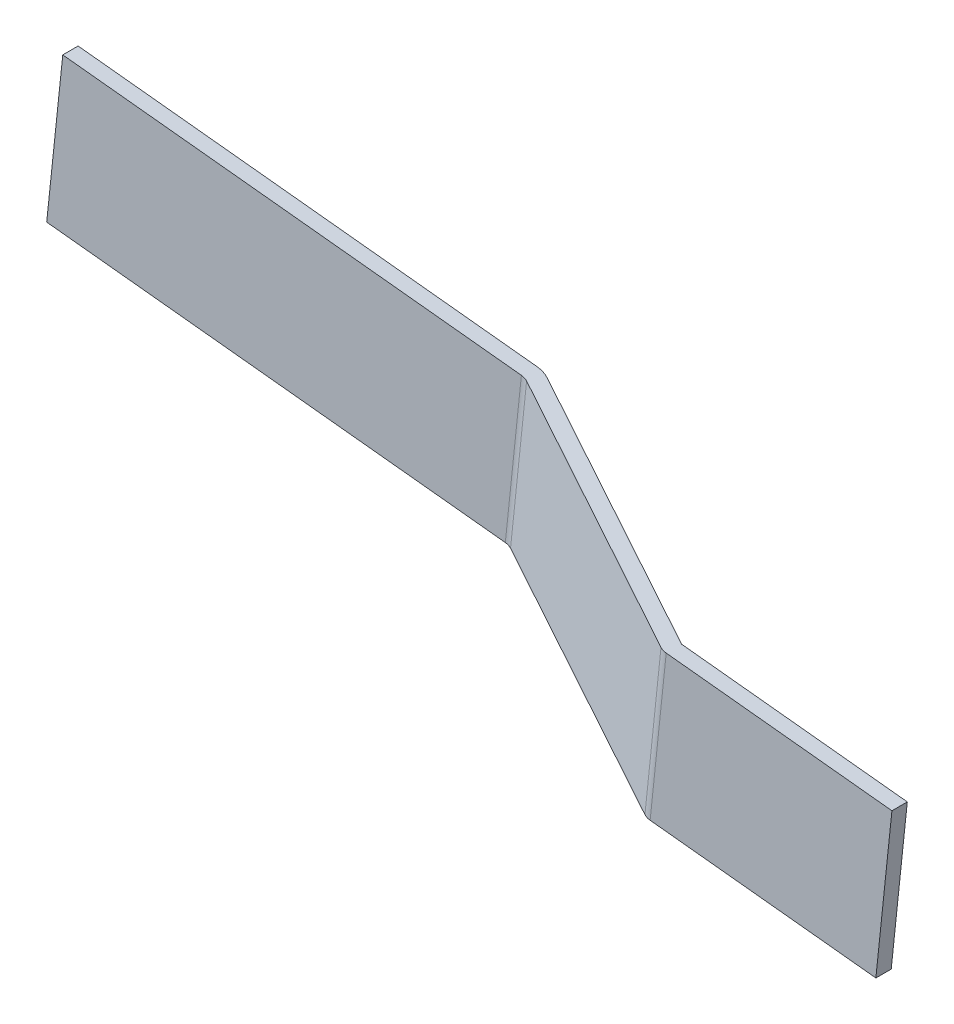
ISO-10303-21;
HEADER;
FILE_DESCRIPTION(('STEP AP214'),'2;1');
FILE_NAME('part.step','',(''),(''),'','','');
FILE_SCHEMA(('AUTOMOTIVE_DESIGN { 1 0 10303 214 1 1 1 1 }'));
ENDSEC;
DATA;
#1=APPLICATION_CONTEXT('core data for automotive mechanical design processes');
#2=APPLICATION_PROTOCOL_DEFINITION('international standard','automotive_design',2000,#1);
#3=PRODUCT_CONTEXT('',#1,'mechanical');
#4=PRODUCT('Part','Part','',(#3));
#5=PRODUCT_RELATED_PRODUCT_CATEGORY('part','',(#4));
#6=PRODUCT_DEFINITION_FORMATION('','',#4);
#7=PRODUCT_DEFINITION_CONTEXT('part definition',#1,'design');
#8=PRODUCT_DEFINITION('design','',#6,#7);
#9=PRODUCT_DEFINITION_SHAPE('','',#8);
#10=(LENGTH_UNIT() NAMED_UNIT(*) SI_UNIT(.MILLI.,.METRE.));
#11=(NAMED_UNIT(*) PLANE_ANGLE_UNIT() SI_UNIT($,.RADIAN.));
#12=(NAMED_UNIT(*) SI_UNIT($,.STERADIAN.) SOLID_ANGLE_UNIT());
#13=UNCERTAINTY_MEASURE_WITH_UNIT(LENGTH_MEASURE(1.E-05),#10,'distance_accuracy_value','');
#14=(GEOMETRIC_REPRESENTATION_CONTEXT(3) GLOBAL_UNCERTAINTY_ASSIGNED_CONTEXT((#13)) GLOBAL_UNIT_ASSIGNED_CONTEXT((#10,
#11,#12)) REPRESENTATION_CONTEXT('',''));
#15=CARTESIAN_POINT('',(0.,0.,0.));
#16=DIRECTION('',(0.,0.,1.));
#17=DIRECTION('',(1.,0.,0.));
#18=AXIS2_PLACEMENT_3D('',#15,#16,#17);
#19=CARTESIAN_POINT('',(33.7087147324462,3.75848377105127,-2.032));
#20=DIRECTION('',(0.104528463267647,0.994521895368274,0.));
#21=DIRECTION('',(-0.994521895368274,0.104528463267647,0.));
#22=AXIS2_PLACEMENT_3D('',#19,#20,#21);
#23=CYLINDRICAL_SURFACE('',#22,0.508000000000006);
#24=CARTESIAN_POINT('',(33.7087147324462,3.75848377105124,-2.032));
#25=DIRECTION('',(0.104528463267647,0.994521895368274,0.));
#26=DIRECTION('',(-0.994521895368274,0.104528463267647,0.));
#27=AXIS2_PLACEMENT_3D('',#24,#25,#26);
#28=CIRCLE('',#27,0.508000000000006);
#29=CARTESIAN_POINT('',(33.9341359375676,3.73479104767429,-2.48662944816696));
#30=VERTEX_POINT('',#29);
#31=CARTESIAN_POINT('',(33.7087147324462,3.75848377105125,-2.54));
#32=VERTEX_POINT('',#31);
#33=EDGE_CURVE('E115',#30,#32,#28,.T.);
#34=ORIENTED_EDGE('',*,*,#33,.T.);
#35=DIRECTION('',(-0.104528463267678,-0.994521895368271,0.));
#36=VECTOR('',#35,1.);
#37=CARTESIAN_POINT('',(33.9742170291461,6.28456938528667,-2.54));
#38=LINE('',#37,#36);
#39=CARTESIAN_POINT('',(33.9742170291461,6.28456938528668,-2.54));
#40=VERTEX_POINT('',#39);
#41=EDGE_CURVE('E113',#40,#32,#38,.T.);
#42=ORIENTED_EDGE('',*,*,#41,.F.);
#43=CARTESIAN_POINT('',(33.974217029146,6.28456938528668,-2.032));
#44=DIRECTION('',(0.104528463267647,0.994521895368274,0.));
#45=DIRECTION('',(-0.994521895368274,0.104528463267647,0.));
#46=AXIS2_PLACEMENT_3D('',#43,#44,#45);
#47=CIRCLE('',#46,0.508000000000006);
#48=CARTESIAN_POINT('',(34.1996382342674,6.26087666190973,-2.48662944816696));
#49=VERTEX_POINT('',#48);
#50=EDGE_CURVE('E20',#40,#49,#47,.F.);
#51=ORIENTED_EDGE('',*,*,#50,.T.);
#52=DIRECTION('',(0.104528463267656,0.994521895368273,0.));
#53=VECTOR('',#52,1.);
#54=CARTESIAN_POINT('',(33.9341359375676,3.73479104767429,-2.486629448167));
#55=LINE('',#54,#53);
#56=EDGE_CURVE('E110',#30,#49,#55,.T.);
#57=ORIENTED_EDGE('',*,*,#56,.F.);
#58=EDGE_LOOP('',(#34,#42,#51,#57));
#59=FACE_BOUND('',#58,.T.);
#60=ADVANCED_FACE('F17',(#59),#23,.T.);
#61=CARTESIAN_POINT('',(42.1173531444244,2.87470026113471,0.));
#62=DIRECTION('',(0.994521895368274,-0.104528463267646,0.));
#63=DIRECTION('',(0.104528463267646,0.994521895368274,0.));
#64=AXIS2_PLACEMENT_3D('',#61,#62,#63);
#65=PLANE('',#64);
#66=DIRECTION('',(0.,0.,1.));
#67=VECTOR('',#66,1.);
#68=CARTESIAN_POINT('',(42.1173531444244,2.87470026113471,0.));
#69=LINE('',#68,#67);
#70=CARTESIAN_POINT('',(42.1173531444244,2.87470026113473,0.));
#71=VERTEX_POINT('',#70);
#72=CARTESIAN_POINT('',(42.1173531444245,2.87470026113473,-0.254));
#73=VERTEX_POINT('',#72);
#74=EDGE_CURVE('E225',#71,#73,#69,.F.);
#75=ORIENTED_EDGE('',*,*,#74,.T.);
#76=DIRECTION('',(-0.104528463267677,-0.994521895368271,0.));
#77=VECTOR('',#76,1.);
#78=CARTESIAN_POINT('',(42.3828554411243,5.40078587537014,-0.254000000000001));
#79=LINE('',#78,#77);
#80=CARTESIAN_POINT('',(42.3828554411243,5.40078587537015,-0.254));
#81=VERTEX_POINT('',#80);
#82=EDGE_CURVE('E122',#81,#73,#79,.T.);
#83=ORIENTED_EDGE('',*,*,#82,.F.);
#84=DIRECTION('',(0.,0.,1.));
#85=VECTOR('',#84,1.);
#86=CARTESIAN_POINT('',(42.3828554411243,5.40078587537015,0.));
#87=LINE('',#86,#85);
#88=CARTESIAN_POINT('',(42.3828554411243,5.40078587537016,0.));
#89=VERTEX_POINT('',#88);
#90=EDGE_CURVE('E222',#81,#89,#87,.T.);
#91=ORIENTED_EDGE('',*,*,#90,.T.);
#92=DIRECTION('',(-0.104528463267677,-0.994521895368271,0.));
#93=VECTOR('',#92,1.);
#94=CARTESIAN_POINT('',(42.3828554411243,5.40078587537014,0.));
#95=LINE('',#94,#93);
#96=EDGE_CURVE('E200',#89,#71,#95,.T.);
#97=ORIENTED_EDGE('',*,*,#96,.T.);
#98=EDGE_LOOP('',(#75,#83,#91,#97));
#99=FACE_BOUND('',#98,.T.);
#100=ADVANCED_FACE('F280',(#99),#65,.T.);
#101=CARTESIAN_POINT('',(38.3877045013078,3.26670212957912,-0.254));
#102=DIRECTION('',(0.104528463267648,0.994521895368274,0.));
#103=DIRECTION('',(-0.994521895368274,0.104528463267648,0.));
#104=AXIS2_PLACEMENT_3D('',#101,#102,#103);
#105=CYLINDRICAL_SURFACE('',#104,0.253999999999999);
#106=CARTESIAN_POINT('',(38.3877045013078,3.26670212957912,-0.254));
#107=DIRECTION('',(0.104528463267648,0.994521895368274,0.));
#108=DIRECTION('',(-0.994521895368274,0.104528463267648,0.));
#109=AXIS2_PLACEMENT_3D('',#106,#107,#108);
#110=CIRCLE('',#109,0.253999999999999);
#111=CARTESIAN_POINT('',(38.2749938987471,3.27854849126762,-0.0266852759165332));
#112=VERTEX_POINT('',#111);
#113=CARTESIAN_POINT('',(38.3877045013078,3.26670212957915,0.));
#114=VERTEX_POINT('',#113);
#115=EDGE_CURVE('E213',#112,#114,#110,.T.);
#116=ORIENTED_EDGE('',*,*,#115,.T.);
#117=DIRECTION('',(0.104528463267676,0.994521895368271,0.));
#118=VECTOR('',#117,1.);
#119=CARTESIAN_POINT('',(38.3877045013078,3.26670212957913,0.));
#120=LINE('',#119,#118);
#121=CARTESIAN_POINT('',(38.6532067980076,5.79278774381459,0.));
#122=VERTEX_POINT('',#121);
#123=EDGE_CURVE('E196',#114,#122,#120,.T.);
#124=ORIENTED_EDGE('',*,*,#123,.T.);
#125=CARTESIAN_POINT('',(38.6532067980076,5.79278774381458,-0.254000000000001));
#126=DIRECTION('',(0.104528463267648,0.994521895368274,0.));
#127=DIRECTION('',(-0.994521895368274,0.104528463267648,0.));
#128=AXIS2_PLACEMENT_3D('',#125,#126,#127);
#129=CIRCLE('',#128,0.253999999999999);
#130=CARTESIAN_POINT('',(38.5404961954469,5.80463410550306,-0.0266852759165311));
#131=VERTEX_POINT('',#130);
#132=EDGE_CURVE('E230',#122,#131,#129,.F.);
#133=ORIENTED_EDGE('',*,*,#132,.T.);
#134=DIRECTION('',(-0.10452846326761,-0.994521895368278,0.));
#135=VECTOR('',#134,1.);
#136=CARTESIAN_POINT('',(38.5404961954469,5.80463410550307,-0.0266852759165698));
#137=LINE('',#136,#135);
#138=EDGE_CURVE('E192',#131,#112,#137,.T.);
#139=ORIENTED_EDGE('',*,*,#138,.T.);
#140=EDGE_LOOP('',(#116,#124,#133,#139));
#141=FACE_BOUND('',#140,.T.);
#142=ADVANCED_FACE('F277',(#141),#105,.T.);
#143=CARTESIAN_POINT('',(33.7087147324462,3.75848377105127,-2.54));
#144=DIRECTION('',(0.,0.,-1.));
#145=DIRECTION('',(0.,1.,0.));
#146=AXIS2_PLACEMENT_3D('',#143,#144,#145);
#147=PLANE('',#146);
#148=DIRECTION('',(0.994521895368274,-0.104528463267648,0.));
#149=VECTOR('',#148,1.);
#150=CARTESIAN_POINT('',(33.7087147324462,3.75848377105127,-2.54));
#151=LINE('',#150,#149);
#152=CARTESIAN_POINT('',(26.1304578897399,4.55499066115074,-2.54));
#153=VERTEX_POINT('',#152);
#154=EDGE_CURVE('E182',#153,#32,#151,.T.);
#155=ORIENTED_EDGE('',*,*,#154,.F.);
#156=DIRECTION('',(-0.104528463267646,-0.994521895368274,0.));
#157=VECTOR('',#156,1.);
#158=CARTESIAN_POINT('',(26.1304578897399,4.55499066115073,-2.54));
#159=LINE('',#158,#157);
#160=CARTESIAN_POINT('',(26.3959601864397,7.08107627538616,-2.54));
#161=VERTEX_POINT('',#160);
#162=EDGE_CURVE('E163',#161,#153,#159,.T.);
#163=ORIENTED_EDGE('',*,*,#162,.F.);
#164=DIRECTION('',(0.994521895368274,-0.104528463267648,0.));
#165=VECTOR('',#164,1.);
#166=CARTESIAN_POINT('',(33.9742170291461,6.28456938528668,-2.54));
#167=LINE('',#166,#165);
#168=EDGE_CURVE('E130',#161,#40,#167,.T.);
#169=ORIENTED_EDGE('',*,*,#168,.T.);
#170=ORIENTED_EDGE('',*,*,#41,.T.);
#171=EDGE_LOOP('',(#155,#163,#169,#170));
#172=FACE_BOUND('',#171,.T.);
#173=ADVANCED_FACE('F248',(#172),#147,.T.);
#174=CARTESIAN_POINT('',(38.3877045013078,3.26670212957912,-0.254));
#175=DIRECTION('',(0.443742529766581,-0.0466392192459703,-0.894939858596365));
#176=DIRECTION('',(-0.895914793501176,0.,-0.444225936642319));
#177=AXIS2_PLACEMENT_3D('',#174,#175,#176);
#178=PLANE('',#177);
#179=DIRECTION('',(0.890037284411877,-0.0935466881360443,0.446186787674747));
#180=VECTOR('',#179,1.);
#181=CARTESIAN_POINT('',(33.9341359375676,3.73479104767432,-2.48662944816695));
#182=LINE('',#181,#180);
#183=CARTESIAN_POINT('',(38.3877045013078,3.26670212957915,-0.254));
#184=VERTEX_POINT('',#183);
#185=EDGE_CURVE('E121',#30,#184,#182,.T.);
#186=ORIENTED_EDGE('',*,*,#185,.F.);
#187=ORIENTED_EDGE('',*,*,#56,.T.);
#188=DIRECTION('',(0.890037284411876,-0.0935466881360444,0.446186787674747));
#189=VECTOR('',#188,1.);
#190=CARTESIAN_POINT('',(34.1996382342674,6.26087666190974,-2.48662944816695));
#191=LINE('',#190,#189);
#192=CARTESIAN_POINT('',(38.6532067980077,5.79278774381459,-0.254));
#193=VERTEX_POINT('',#192);
#194=EDGE_CURVE('E120',#49,#193,#191,.T.);
#195=ORIENTED_EDGE('',*,*,#194,.T.);
#196=DIRECTION('',(0.104528463267657,0.994521895368273,0.));
#197=VECTOR('',#196,1.);
#198=CARTESIAN_POINT('',(38.3877045013078,3.26670212957912,-0.254000000000001));
#199=LINE('',#198,#197);
#200=EDGE_CURVE('E204',#184,#193,#199,.T.);
#201=ORIENTED_EDGE('',*,*,#200,.F.);
#202=EDGE_LOOP('',(#186,#187,#195,#201));
#203=FACE_BOUND('',#202,.T.);
#204=ADVANCED_FACE('F118',(#203),#178,.T.);
#205=CARTESIAN_POINT('',(42.1173531444244,2.87470026113471,-0.254));
#206=DIRECTION('',(0.,0.,-1.));
#207=DIRECTION('',(-1.,0.,0.));
#208=AXIS2_PLACEMENT_3D('',#205,#206,#207);
#209=PLANE('',#208);
#210=DIRECTION('',(0.994521895368274,-0.104528463267648,0.));
#211=VECTOR('',#210,1.);
#212=CARTESIAN_POINT('',(33.7087147324462,3.75848377105127,-0.253999999999999));
#213=LINE('',#212,#211);
#214=EDGE_CURVE('E177',#184,#73,#213,.T.);
#215=ORIENTED_EDGE('',*,*,#214,.F.);
#216=ORIENTED_EDGE('',*,*,#200,.T.);
#217=DIRECTION('',(0.994521895368274,-0.104528463267648,0.));
#218=VECTOR('',#217,1.);
#219=CARTESIAN_POINT('',(33.9742170291461,6.28456938528668,-0.253999999999999));
#220=LINE('',#219,#218);
#221=EDGE_CURVE('E128',#193,#81,#220,.T.);
#222=ORIENTED_EDGE('',*,*,#221,.T.);
#223=ORIENTED_EDGE('',*,*,#82,.T.);
#224=EDGE_LOOP('',(#215,#216,#222,#223));
#225=FACE_BOUND('',#224,.T.);
#226=ADVANCED_FACE('F282',(#225),#209,.T.);
#227=CARTESIAN_POINT('',(42.1173531444244,2.87470026113471,0.));
#228=DIRECTION('',(0.,0.,-1.));
#229=DIRECTION('',(-1.,0.,0.));
#230=AXIS2_PLACEMENT_3D('',#227,#228,#229);
#231=PLANE('',#230);
#232=ORIENTED_EDGE('',*,*,#123,.F.);
#233=DIRECTION('',(0.994521895368274,-0.104528463267648,0.));
#234=VECTOR('',#233,1.);
#235=CARTESIAN_POINT('',(33.7087147324462,3.75848377105127,0.));
#236=LINE('',#235,#234);
#237=EDGE_CURVE('E173',#71,#114,#236,.F.);
#238=ORIENTED_EDGE('',*,*,#237,.F.);
#239=ORIENTED_EDGE('',*,*,#96,.F.);
#240=DIRECTION('',(0.994521895368274,-0.104528463267648,0.));
#241=VECTOR('',#240,1.);
#242=CARTESIAN_POINT('',(33.9742170291461,6.28456938528668,0.));
#243=LINE('',#242,#241);
#244=EDGE_CURVE('E136',#89,#122,#243,.F.);
#245=ORIENTED_EDGE('',*,*,#244,.T.);
#246=EDGE_LOOP('',(#232,#238,#239,#245));
#247=FACE_BOUND('',#246,.T.);
#248=ADVANCED_FACE('F273',(#247),#231,.F.);
#249=CARTESIAN_POINT('',(38.2749938987471,3.27854849126759,-0.0266852759165226));
#250=DIRECTION('',(0.443742529766581,-0.0466392192459703,-0.894939858596365));
#251=DIRECTION('',(-0.895914793501176,0.,-0.444225936642319));
#252=AXIS2_PLACEMENT_3D('',#249,#250,#251);
#253=PLANE('',#252);
#254=DIRECTION('',(0.104528463267648,0.994521895368274,0.));
#255=VECTOR('',#254,1.);
#256=CARTESIAN_POINT('',(33.8214253350069,3.74663740936279,-2.25931472408349));
#257=LINE('',#256,#255);
#258=CARTESIAN_POINT('',(34.0869276317067,6.27272302359821,-2.25931472408348));
#259=VERTEX_POINT('',#258);
#260=CARTESIAN_POINT('',(33.8214253350069,3.74663740936278,-2.25931472408349));
#261=VERTEX_POINT('',#260);
#262=EDGE_CURVE('E187',#259,#261,#257,.F.);
#263=ORIENTED_EDGE('',*,*,#262,.T.);
#264=DIRECTION('',(-0.890037284411875,0.0935466881360441,-0.446186787674751));
#265=VECTOR('',#264,1.);
#266=CARTESIAN_POINT('',(38.2749938987472,3.27854849126764,-0.0266852759165217));
#267=LINE('',#266,#265);
#268=EDGE_CURVE('E170',#112,#261,#267,.T.);
#269=ORIENTED_EDGE('',*,*,#268,.F.);
#270=ORIENTED_EDGE('',*,*,#138,.F.);
#271=DIRECTION('',(-0.890037284411873,0.093546688136044,-0.446186787674755));
#272=VECTOR('',#271,1.);
#273=CARTESIAN_POINT('',(38.5404961954469,5.80463410550308,-0.0266852759165199));
#274=LINE('',#273,#272);
#275=EDGE_CURVE('E240',#131,#259,#274,.T.);
#276=ORIENTED_EDGE('',*,*,#275,.T.);
#277=EDGE_LOOP('',(#263,#269,#270,#276));
#278=FACE_BOUND('',#277,.T.);
#279=ADVANCED_FACE('F262',(#278),#253,.F.);
#280=CARTESIAN_POINT('',(33.7087147324462,3.75848377105127,-2.032));
#281=DIRECTION('',(0.104528463267648,0.994521895368274,0.));
#282=DIRECTION('',(-0.994521895368274,0.104528463267648,0.));
#283=AXIS2_PLACEMENT_3D('',#280,#281,#282);
#284=CYLINDRICAL_SURFACE('',#283,0.253999999999999);
#285=DIRECTION('',(-0.104528463267678,-0.994521895368271,0.));
#286=VECTOR('',#285,1.);
#287=CARTESIAN_POINT('',(33.9742170291461,6.28456938528668,-2.286));
#288=LINE('',#287,#286);
#289=CARTESIAN_POINT('',(33.9742170291461,6.28456938528668,-2.286));
#290=VERTEX_POINT('',#289);
#291=CARTESIAN_POINT('',(33.7087147324462,3.75848377105125,-2.286));
#292=VERTEX_POINT('',#291);
#293=EDGE_CURVE('E147',#290,#292,#288,.T.);
#294=ORIENTED_EDGE('',*,*,#293,.T.);
#295=CARTESIAN_POINT('',(33.7087147324462,3.75848377105124,-2.032));
#296=DIRECTION('',(0.104528463267648,0.994521895368274,0.));
#297=DIRECTION('',(-0.994521895368274,0.104528463267648,0.));
#298=AXIS2_PLACEMENT_3D('',#295,#296,#297);
#299=CIRCLE('',#298,0.253999999999999);
#300=EDGE_CURVE('E172',#261,#292,#299,.T.);
#301=ORIENTED_EDGE('',*,*,#300,.F.);
#302=ORIENTED_EDGE('',*,*,#262,.F.);
#303=CARTESIAN_POINT('',(33.974217029146,6.28456938528669,-2.032));
#304=DIRECTION('',(0.104528463267648,0.994521895368274,0.));
#305=DIRECTION('',(-0.994521895368274,0.104528463267648,0.));
#306=AXIS2_PLACEMENT_3D('',#303,#304,#305);
#307=CIRCLE('',#306,0.253999999999999);
#308=EDGE_CURVE('E150',#259,#290,#307,.T.);
#309=ORIENTED_EDGE('',*,*,#308,.T.);
#310=EDGE_LOOP('',(#294,#301,#302,#309));
#311=FACE_BOUND('',#310,.T.);
#312=ADVANCED_FACE('F303',(#311),#284,.F.);
#313=CARTESIAN_POINT('',(33.7087147324462,3.75848377105127,-2.032));
#314=DIRECTION('',(-0.104528463267648,-0.994521895368274,0.));
#315=DIRECTION('',(0.994521895368274,-0.104528463267648,0.));
#316=AXIS2_PLACEMENT_3D('',#313,#314,#315);
#317=PLANE('',#316);
#318=ORIENTED_EDGE('',*,*,#268,.T.);
#319=ORIENTED_EDGE('',*,*,#300,.T.);
#320=DIRECTION('',(-0.994521895368274,0.104528463267646,0.));
#321=VECTOR('',#320,1.);
#322=CARTESIAN_POINT('',(33.7087147324462,3.75848377105127,-2.286));
#323=LINE('',#322,#321);
#324=CARTESIAN_POINT('',(26.1304578897399,4.55499066115074,-2.286));
#325=VERTEX_POINT('',#324);
#326=EDGE_CURVE('E149',#292,#325,#323,.T.);
#327=ORIENTED_EDGE('',*,*,#326,.T.);
#328=DIRECTION('',(0.,0.,1.));
#329=VECTOR('',#328,1.);
#330=CARTESIAN_POINT('',(26.1304578897399,4.55499066115073,-2.54));
#331=LINE('',#330,#329);
#332=EDGE_CURVE('E155',#153,#325,#331,.T.);
#333=ORIENTED_EDGE('',*,*,#332,.F.);
#334=ORIENTED_EDGE('',*,*,#154,.T.);
#335=ORIENTED_EDGE('',*,*,#33,.F.);
#336=ORIENTED_EDGE('',*,*,#185,.T.);
#337=ORIENTED_EDGE('',*,*,#214,.T.);
#338=ORIENTED_EDGE('',*,*,#74,.F.);
#339=ORIENTED_EDGE('',*,*,#237,.T.);
#340=ORIENTED_EDGE('',*,*,#115,.F.);
#341=EDGE_LOOP('',(#318,#319,#327,#333,#334,#335,#336,#337,#338,#339,#340));
#342=FACE_BOUND('',#341,.T.);
#343=ADVANCED_FACE('F250',(#342),#317,.T.);
#344=CARTESIAN_POINT('',(26.1304578897399,4.55499066115073,-2.54));
#345=DIRECTION('',(-0.994521895368274,0.104528463267646,0.));
#346=DIRECTION('',(-0.104528463267646,-0.994521895368274,0.));
#347=AXIS2_PLACEMENT_3D('',#344,#345,#346);
#348=PLANE('',#347);
#349=ORIENTED_EDGE('',*,*,#332,.T.);
#350=DIRECTION('',(0.104528463267659,0.994521895368273,0.));
#351=VECTOR('',#350,1.);
#352=CARTESIAN_POINT('',(26.1304578897399,4.55499066115074,-2.286));
#353=LINE('',#352,#351);
#354=CARTESIAN_POINT('',(26.3959601864397,7.08107627538616,-2.286));
#355=VERTEX_POINT('',#354);
#356=EDGE_CURVE('E26',#325,#355,#353,.T.);
#357=ORIENTED_EDGE('',*,*,#356,.T.);
#358=DIRECTION('',(0.,0.,1.));
#359=VECTOR('',#358,1.);
#360=CARTESIAN_POINT('',(26.3959601864397,7.08107627538617,-2.032));
#361=LINE('',#360,#359);
#362=EDGE_CURVE('E34',#355,#161,#361,.F.);
#363=ORIENTED_EDGE('',*,*,#362,.T.);
#364=ORIENTED_EDGE('',*,*,#162,.T.);
#365=EDGE_LOOP('',(#349,#357,#363,#364));
#366=FACE_BOUND('',#365,.T.);
#367=ADVANCED_FACE('F254',(#366),#348,.T.);
#368=CARTESIAN_POINT('',(33.9742170291461,6.28456938528668,-2.032));
#369=DIRECTION('',(-0.104528463267648,-0.994521895368274,0.));
#370=DIRECTION('',(0.994521895368274,-0.104528463267648,0.));
#371=AXIS2_PLACEMENT_3D('',#368,#369,#370);
#372=PLANE('',#371);
#373=ORIENTED_EDGE('',*,*,#308,.F.);
#374=ORIENTED_EDGE('',*,*,#275,.F.);
#375=ORIENTED_EDGE('',*,*,#132,.F.);
#376=ORIENTED_EDGE('',*,*,#244,.F.);
#377=ORIENTED_EDGE('',*,*,#90,.F.);
#378=ORIENTED_EDGE('',*,*,#221,.F.);
#379=ORIENTED_EDGE('',*,*,#194,.F.);
#380=ORIENTED_EDGE('',*,*,#50,.F.);
#381=ORIENTED_EDGE('',*,*,#168,.F.);
#382=ORIENTED_EDGE('',*,*,#362,.F.);
#383=DIRECTION('',(0.994521895368274,-0.104528463267645,0.));
#384=VECTOR('',#383,1.);
#385=CARTESIAN_POINT('',(26.3959601864397,7.08107627538615,-2.286));
#386=LINE('',#385,#384);
#387=EDGE_CURVE('E11',#355,#290,#386,.T.);
#388=ORIENTED_EDGE('',*,*,#387,.T.);
#389=EDGE_LOOP('',(#373,#374,#375,#376,#377,#378,#379,#380,#381,#382,#388));
#390=FACE_BOUND('',#389,.T.);
#391=ADVANCED_FACE('F126',(#390),#372,.F.);
#392=CARTESIAN_POINT('',(33.7087147324462,3.75848377105127,-2.286));
#393=DIRECTION('',(0.,0.,-1.));
#394=DIRECTION('',(0.,1.,0.));
#395=AXIS2_PLACEMENT_3D('',#392,#393,#394);
#396=PLANE('',#395);
#397=ORIENTED_EDGE('',*,*,#356,.F.);
#398=ORIENTED_EDGE('',*,*,#326,.F.);
#399=ORIENTED_EDGE('',*,*,#293,.F.);
#400=ORIENTED_EDGE('',*,*,#387,.F.);
#401=EDGE_LOOP('',(#397,#398,#399,#400));
#402=FACE_BOUND('',#401,.T.);
#403=ADVANCED_FACE('F256',(#402),#396,.F.);
#404=CLOSED_SHELL('',(#60,#100,#142,#173,#204,#226,#248,#279,#312,#343,#367,#391,#403));
#405=MANIFOLD_SOLID_BREP('B1',#404);
#406=ADVANCED_BREP_SHAPE_REPRESENTATION('',(#18,#405),#14);
#407=SHAPE_DEFINITION_REPRESENTATION(#9,#406);
ENDSEC;
END-ISO-10303-21;
